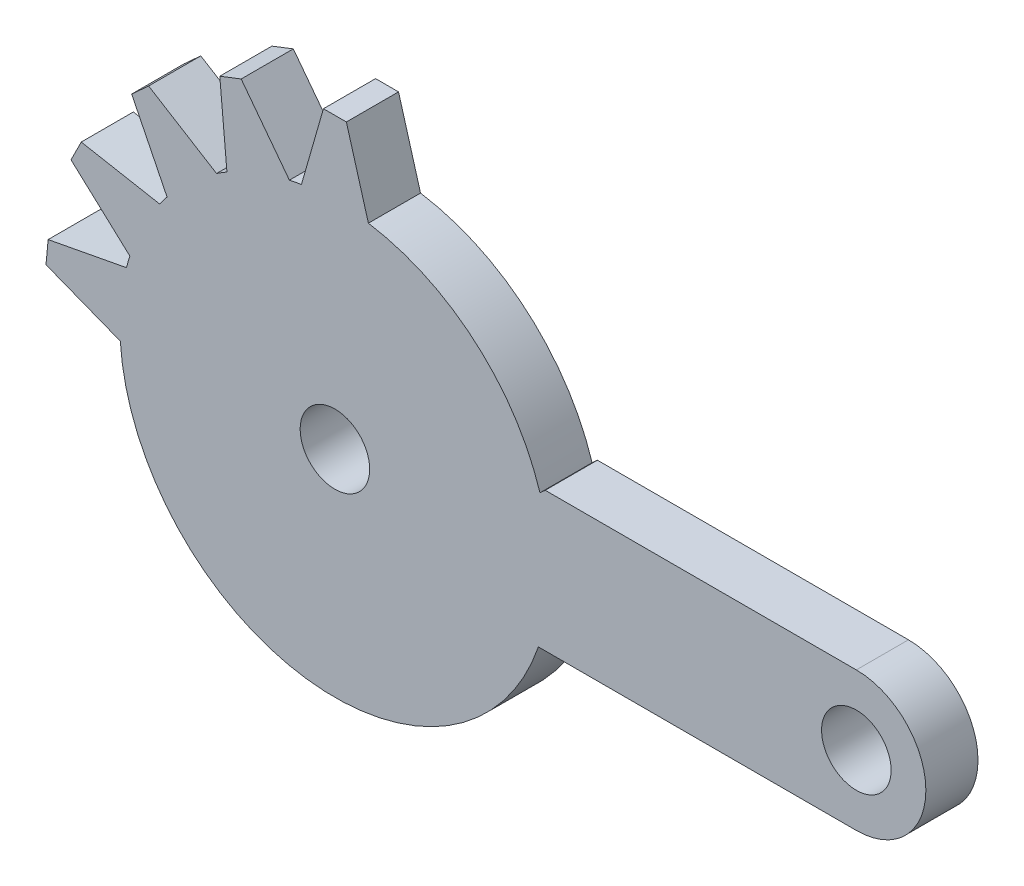
ISO-10303-21;
HEADER;
FILE_DESCRIPTION(('STEP AP214'),'2;1');
FILE_NAME('part.step','',(''),(''),'','','');
FILE_SCHEMA(('AUTOMOTIVE_DESIGN { 1 0 10303 214 1 1 1 1 }'));
ENDSEC;
DATA;
#1=APPLICATION_CONTEXT('core data for automotive mechanical design processes');
#2=APPLICATION_PROTOCOL_DEFINITION('international standard','automotive_design',2000,#1);
#3=PRODUCT_CONTEXT('',#1,'mechanical');
#4=PRODUCT('Part','Part','',(#3));
#5=PRODUCT_RELATED_PRODUCT_CATEGORY('part','',(#4));
#6=PRODUCT_DEFINITION_FORMATION('','',#4);
#7=PRODUCT_DEFINITION_CONTEXT('part definition',#1,'design');
#8=PRODUCT_DEFINITION('design','',#6,#7);
#9=PRODUCT_DEFINITION_SHAPE('','',#8);
#10=(LENGTH_UNIT() NAMED_UNIT(*) SI_UNIT(.MILLI.,.METRE.));
#11=(NAMED_UNIT(*) PLANE_ANGLE_UNIT() SI_UNIT($,.RADIAN.));
#12=(NAMED_UNIT(*) SI_UNIT($,.STERADIAN.) SOLID_ANGLE_UNIT());
#13=UNCERTAINTY_MEASURE_WITH_UNIT(LENGTH_MEASURE(1.E-05),#10,'distance_accuracy_value','');
#14=(GEOMETRIC_REPRESENTATION_CONTEXT(3) GLOBAL_UNCERTAINTY_ASSIGNED_CONTEXT((#13)) GLOBAL_UNIT_ASSIGNED_CONTEXT((#10,
#11,#12)) REPRESENTATION_CONTEXT('',''));
#15=CARTESIAN_POINT('',(0.,0.,0.));
#16=DIRECTION('',(0.,0.,1.));
#17=DIRECTION('',(1.,0.,0.));
#18=AXIS2_PLACEMENT_3D('',#15,#16,#17);
#19=CARTESIAN_POINT('',(0.,0.,0.));
#20=DIRECTION('',(0.,0.,1.));
#21=DIRECTION('',(1.,0.,0.));
#22=AXIS2_PLACEMENT_3D('',#19,#20,#21);
#23=PLANE('',#22);
#24=CARTESIAN_POINT('',(30.,0.,0.));
#25=DIRECTION('',(0.,0.,1.));
#26=DIRECTION('',(1.,0.,0.));
#27=AXIS2_PLACEMENT_3D('',#24,#25,#26);
#28=CIRCLE('',#27,2.);
#29=CARTESIAN_POINT('',(32.,0.,0.));
#30=VERTEX_POINT('',#29);
#31=EDGE_CURVE('E298',#30,#30,#28,.T.);
#32=ORIENTED_EDGE('',*,*,#31,.T.);
#33=EDGE_LOOP('',(#32));
#34=FACE_BOUND('',#33,.T.);
#35=DIRECTION('',(-1.,0.,0.));
#36=VECTOR('',#35,1.);
#37=CARTESIAN_POINT('',(0.,-4.00000000000001,0.));
#38=LINE('',#37,#36);
#39=CARTESIAN_POINT('',(30.,-4.00000000000001,0.));
#40=VERTEX_POINT('',#39);
#41=CARTESIAN_POINT('',(11.7073532313553,-4.00000000000001,0.));
#42=VERTEX_POINT('',#41);
#43=EDGE_CURVE('E241',#40,#42,#38,.T.);
#44=ORIENTED_EDGE('',*,*,#43,.T.);
#45=CARTESIAN_POINT('',(0.,0.,0.));
#46=DIRECTION('',(0.,0.,1.));
#47=DIRECTION('',(1.,0.,0.));
#48=AXIS2_PLACEMENT_3D('',#45,#46,#47);
#49=CIRCLE('',#48,12.3718276614139);
#50=CARTESIAN_POINT('',(-12.346524215559,-0.79085996125604,0.));
#51=VERTEX_POINT('',#50);
#52=EDGE_CURVE('E257',#51,#42,#49,.T.);
#53=ORIENTED_EDGE('',*,*,#52,.F.);
#54=DIRECTION('',(0.931579230851431,-0.363538356499361,0.));
#55=VECTOR('',#54,1.);
#56=CARTESIAN_POINT('',(-1.89955474422704,-4.86767273920467,0.));
#57=LINE('',#56,#55);
#58=CARTESIAN_POINT('',(-16.6216936738179,0.877477016578463,0.));
#59=VERTEX_POINT('',#58);
#60=EDGE_CURVE('E133',#59,#51,#57,.T.);
#61=ORIENTED_EDGE('',*,*,#60,.F.);
#62=DIRECTION('',(0.0922683594632989,0.995734176295035,0.));
#63=VECTOR('',#62,1.);
#64=CARTESIAN_POINT('',(-16.5608037025292,1.53458445577481,0.));
#65=LINE('',#64,#63);
#66=CARTESIAN_POINT('',(-16.499913731241,2.19169189496574,0.));
#67=VERTEX_POINT('',#66);
#68=EDGE_CURVE('E218',#59,#67,#65,.T.);
#69=ORIENTED_EDGE('',*,*,#68,.T.);
#70=DIRECTION('',(0.982517321865762,0.186171190665287,0.));
#71=VECTOR('',#70,1.);
#72=CARTESIAN_POINT('',(-0.972778696233403,5.13383362901551,0.));
#73=LINE('',#72,#71);
#74=CARTESIAN_POINT('',(-11.9909810419501,3.04606193884591,0.));
#75=VERTEX_POINT('',#74);
#76=EDGE_CURVE('E293',#67,#75,#73,.T.);
#77=ORIENTED_EDGE('',*,*,#76,.T.);
#78=CARTESIAN_POINT('',(-11.7984825308017,3.72262402803044,0.));
#79=VERTEX_POINT('',#78);
#80=EDGE_CURVE('E292',#79,#75,#49,.T.);
#81=ORIENTED_EDGE('',*,*,#80,.F.);
#82=DIRECTION('',(0.73734656063406,-0.675514655297073,0.));
#83=VECTOR('',#82,1.);
#84=CARTESIAN_POINT('',(-3.52968825798848,-3.85277133031804,0.));
#85=LINE('',#84,#83);
#86=CARTESIAN_POINT('',(-15.1822864969912,6.82267126748337,0.));
#87=VERTEX_POINT('',#86);
#88=EDGE_CURVE('E290',#87,#79,#85,.T.);
#89=ORIENTED_EDGE('',*,*,#88,.F.);
#90=DIRECTION('',(0.445738355776538,0.895163291355062,0.));
#91=VECTOR('',#90,1.);
#92=CARTESIAN_POINT('',(-14.8881337035164,7.41340971158574,0.));
#93=LINE('',#92,#91);
#94=CARTESIAN_POINT('',(-14.5939809100432,8.00414815568488,0.));
#95=VERTEX_POINT('',#94);
#96=EDGE_CURVE('E287',#87,#95,#93,.T.);
#97=ORIENTED_EDGE('',*,*,#96,.T.);
#98=DIRECTION('',(0.983422908660538,-0.181326729198004,0.));
#99=VECTOR('',#98,1.);
#100=CARTESIAN_POINT('',(0.947465494479553,5.13856548649881,0.));
#101=LINE('',#100,#99);
#102=CARTESIAN_POINT('',(-10.0808923348342,7.17201013783286,0.));
#103=VERTEX_POINT('',#102);
#104=EDGE_CURVE('E284',#95,#103,#101,.T.);
#105=ORIENTED_EDGE('',*,*,#104,.T.);
#106=CARTESIAN_POINT('',(-9.65699040261054,7.7333470145594,0.));
#107=VERTEX_POINT('',#106);
#108=EDGE_CURVE('E283',#107,#103,#49,.T.);
#109=ORIENTED_EDGE('',*,*,#108,.F.);
#110=DIRECTION('',(0.443531151624721,-0.89625895674099,0.));
#111=VECTOR('',#110,1.);
#112=CARTESIAN_POINT('',(-4.68311781383045,-2.31753180432955,0.));
#113=LINE('',#112,#111);
#114=CARTESIAN_POINT('',(-11.6924274007918,11.846425957988,0.));
#115=VERTEX_POINT('',#114);
#116=EDGE_CURVE('E281',#115,#107,#113,.T.);
#117=ORIENTED_EDGE('',*,*,#116,.F.);
#118=DIRECTION('',(0.739008917220658,0.673695643646558,0.));
#119=VECTOR('',#118,1.);
#120=CARTESIAN_POINT('',(-11.2047387498471,12.291012906726,0.));
#121=LINE('',#120,#119);
#122=CARTESIAN_POINT('',(-10.7170500989039,12.7355998554627,0.));
#123=VERTEX_POINT('',#122);
#124=EDGE_CURVE('E278',#115,#123,#121,.T.);
#125=ORIENTED_EDGE('',*,*,#124,.T.);
#126=DIRECTION('',(0.851511782306255,-0.524335469517011,0.));
#127=VECTOR('',#126,1.);
#128=CARTESIAN_POINT('',(2.73974922007617,4.449305601256,0.));
#129=LINE('',#128,#127);
#130=CARTESIAN_POINT('',(-6.80932325774574,10.3293386262251,0.));
#131=VERTEX_POINT('',#130);
#132=EDGE_CURVE('E275',#123,#131,#129,.T.);
#133=ORIENTED_EDGE('',*,*,#132,.T.);
#134=CARTESIAN_POINT('',(-6.21126820931536,10.6996386348167,0.));
#135=VERTEX_POINT('',#134);
#136=EDGE_CURVE('E274',#135,#131,#49,.T.);
#137=ORIENTED_EDGE('',*,*,#136,.F.);
#138=DIRECTION('',(0.08981440289751,-0.995958519734715,0.));
#139=VECTOR('',#138,1.);
#140=CARTESIAN_POINT('',(-5.20406635886307,-0.469296766279788,0.));
#141=LINE('',#140,#139);
#142=CARTESIAN_POINT('',(-6.62344119413828,15.2702551795539,0.));
#143=VERTEX_POINT('',#142);
#144=EDGE_CURVE('E272',#143,#135,#141,.T.);
#145=ORIENTED_EDGE('',*,*,#144,.F.);
#146=DIRECTION('',(0.932472229404356,0.361241666187153,0.));
#147=VECTOR('',#146,1.);
#148=CARTESIAN_POINT('',(-6.0080817404101,15.5086467019597,0.));
#149=LINE('',#148,#147);
#150=CARTESIAN_POINT('',(-5.39272228668254,15.7470382243652,0.));
#151=VERTEX_POINT('',#150);
#152=EDGE_CURVE('E269',#143,#151,#149,.T.);
#153=ORIENTED_EDGE('',*,*,#152,.T.);
#154=DIRECTION('',(0.604599271361842,-0.796529799234611,0.));
#155=VECTOR('',#154,1.);
#156=CARTESIAN_POINT('',(4.16201463202746,3.15914234010969,0.));
#157=LINE('',#156,#155);
#158=CARTESIAN_POINT('',(-2.61811734293581,12.0916326963042,0.));
#159=VERTEX_POINT('',#158);
#160=EDGE_CURVE('E266',#151,#159,#157,.T.);
#161=ORIENTED_EDGE('',*,*,#160,.T.);
#162=CARTESIAN_POINT('',(-1.92667982652666,12.2208847686974,0.));
#163=VERTEX_POINT('',#162);
#164=EDGE_CURVE('E258',#163,#159,#49,.T.);
#165=ORIENTED_EDGE('',*,*,#164,.F.);
#166=DIRECTION('',(-0.276032278619796,-0.961148365841592,0.));
#167=VECTOR('',#166,1.);
#168=CARTESIAN_POINT('',(-5.02217690540434,1.44231940051902,0.));
#169=LINE('',#168,#167);
#170=CARTESIAN_POINT('',(-0.659922552461371,16.6317518237161,0.));
#171=VERTEX_POINT('',#170);
#172=EDGE_CURVE('E264',#171,#163,#169,.T.);
#173=ORIENTED_EDGE('',*,*,#172,.F.);
#174=DIRECTION('',(1.,0.,0.));
#175=VECTOR('',#174,1.);
#176=CARTESIAN_POINT('',(0.,16.6317518237161,0.));
#177=LINE('',#176,#175);
#178=CARTESIAN_POINT('',(0.659922552461371,16.6317518237161,0.));
#179=VERTEX_POINT('',#178);
#180=EDGE_CURVE('E261',#171,#179,#177,.T.);
#181=ORIENTED_EDGE('',*,*,#180,.T.);
#182=DIRECTION('',(0.276032278619796,-0.961148365841592,0.));
#183=VECTOR('',#182,1.);
#184=CARTESIAN_POINT('',(5.02217690540434,1.44231940051902,0.));
#185=LINE('',#184,#183);
#186=CARTESIAN_POINT('',(1.92667982652666,12.2208847686974,0.));
#187=VERTEX_POINT('',#186);
#188=EDGE_CURVE('E256',#179,#187,#185,.T.);
#189=ORIENTED_EDGE('',*,*,#188,.T.);
#190=CARTESIAN_POINT('',(11.7984825308026,3.72262402803444,0.));
#191=VERTEX_POINT('',#190);
#192=EDGE_CURVE('E253',#191,#187,#49,.T.);
#193=ORIENTED_EDGE('',*,*,#192,.F.);
#194=DIRECTION('',(-0.73734656063406,-0.675514655297072,0.));
#195=VECTOR('',#194,1.);
#196=CARTESIAN_POINT('',(3.52968825798749,-3.85277133031695,0.));
#197=LINE('',#196,#195);
#198=CARTESIAN_POINT('',(12.101247566806,4.,0.));
#199=VERTEX_POINT('',#198);
#200=EDGE_CURVE('E251',#199,#191,#197,.T.);
#201=ORIENTED_EDGE('',*,*,#200,.F.);
#202=DIRECTION('',(1.,0.,0.));
#203=VECTOR('',#202,1.);
#204=CARTESIAN_POINT('',(0.,4.,0.));
#205=LINE('',#204,#203);
#206=CARTESIAN_POINT('',(30.,4.00000000000001,0.));
#207=VERTEX_POINT('',#206);
#208=EDGE_CURVE('E248',#199,#207,#205,.T.);
#209=ORIENTED_EDGE('',*,*,#208,.T.);
#210=CARTESIAN_POINT('',(30.,0.,0.));
#211=DIRECTION('',(0.,0.,1.));
#212=DIRECTION('',(1.,0.,0.));
#213=AXIS2_PLACEMENT_3D('',#210,#211,#212);
#214=CIRCLE('',#213,4.00000000000001);
#215=EDGE_CURVE('E244',#40,#207,#214,.T.);
#216=ORIENTED_EDGE('',*,*,#215,.F.);
#217=EDGE_LOOP('',(#44,#53,#61,#69,#77,#81,#89,#97,#105,#109,#117,#125,#133,#137,#145,#153,#161,
#165,#173,#181,#189,#193,#201,#209,#216));
#218=FACE_BOUND('',#217,.T.);
#219=CARTESIAN_POINT('',(0.,0.,0.));
#220=DIRECTION('',(0.,0.,1.));
#221=DIRECTION('',(1.,0.,0.));
#222=AXIS2_PLACEMENT_3D('',#219,#220,#221);
#223=CIRCLE('',#222,3.47214490930269);
#224=CARTESIAN_POINT('',(3.47214490930269,0.,0.));
#225=VERTEX_POINT('',#224);
#226=EDGE_CURVE('E11',#225,#225,#223,.F.);
#227=ORIENTED_EDGE('',*,*,#226,.F.);
#228=EDGE_LOOP('',(#227));
#229=FACE_BOUND('',#228,.T.);
#230=ADVANCED_FACE('F37',(#34,#218,#229),#23,.F.);
#231=CARTESIAN_POINT('',(0.,-4.00000000000001,3.));
#232=DIRECTION('',(0.,-1.,0.));
#233=DIRECTION('',(0.,0.,-1.));
#234=AXIS2_PLACEMENT_3D('',#231,#232,#233);
#235=PLANE('',#234);
#236=ORIENTED_EDGE('',*,*,#43,.F.);
#237=DIRECTION('',(0.,0.,-1.));
#238=VECTOR('',#237,1.);
#239=CARTESIAN_POINT('',(30.,-4.00000000000001,3.));
#240=LINE('',#239,#238);
#241=CARTESIAN_POINT('',(30.,-4.00000000000001,3.));
#242=VERTEX_POINT('',#241);
#243=EDGE_CURVE('E46',#242,#40,#240,.T.);
#244=ORIENTED_EDGE('',*,*,#243,.F.);
#245=DIRECTION('',(-1.,0.,0.));
#246=VECTOR('',#245,1.);
#247=CARTESIAN_POINT('',(0.,-4.00000000000001,3.));
#248=LINE('',#247,#246);
#249=CARTESIAN_POINT('',(11.7073532313553,-4.00000000000001,3.));
#250=VERTEX_POINT('',#249);
#251=EDGE_CURVE('E301',#242,#250,#248,.T.);
#252=ORIENTED_EDGE('',*,*,#251,.T.);
#253=DIRECTION('',(0.,0.,-1.));
#254=VECTOR('',#253,1.);
#255=CARTESIAN_POINT('',(11.7073532313553,-4.00000000000001,3.));
#256=LINE('',#255,#254);
#257=EDGE_CURVE('E140',#250,#42,#256,.T.);
#258=ORIENTED_EDGE('',*,*,#257,.T.);
#259=EDGE_LOOP('',(#236,#244,#252,#258));
#260=FACE_BOUND('',#259,.T.);
#261=ADVANCED_FACE('F39',(#260),#235,.T.);
#262=CARTESIAN_POINT('',(30.,0.,3.));
#263=DIRECTION('',(0.,0.,-1.));
#264=DIRECTION('',(-1.,0.,0.));
#265=AXIS2_PLACEMENT_3D('',#262,#263,#264);
#266=CYLINDRICAL_SURFACE('',#265,4.00000000000001);
#267=ORIENTED_EDGE('',*,*,#215,.T.);
#268=DIRECTION('',(0.,0.,-1.));
#269=VECTOR('',#268,1.);
#270=CARTESIAN_POINT('',(30.,4.00000000000001,3.));
#271=LINE('',#270,#269);
#272=CARTESIAN_POINT('',(30.,4.00000000000001,3.));
#273=VERTEX_POINT('',#272);
#274=EDGE_CURVE('E348',#273,#207,#271,.T.);
#275=ORIENTED_EDGE('',*,*,#274,.F.);
#276=CARTESIAN_POINT('',(30.,0.,3.));
#277=DIRECTION('',(0.,0.,1.));
#278=DIRECTION('',(1.,0.,0.));
#279=AXIS2_PLACEMENT_3D('',#276,#277,#278);
#280=CIRCLE('',#279,4.00000000000001);
#281=EDGE_CURVE('E353',#242,#273,#280,.T.);
#282=ORIENTED_EDGE('',*,*,#281,.F.);
#283=ORIENTED_EDGE('',*,*,#243,.T.);
#284=EDGE_LOOP('',(#267,#275,#282,#283));
#285=FACE_BOUND('',#284,.T.);
#286=ADVANCED_FACE('F351',(#285),#266,.T.);
#287=CARTESIAN_POINT('',(0.,4.,3.));
#288=DIRECTION('',(0.,1.,0.));
#289=DIRECTION('',(-1.,0.,0.));
#290=AXIS2_PLACEMENT_3D('',#287,#288,#289);
#291=PLANE('',#290);
#292=ORIENTED_EDGE('',*,*,#208,.F.);
#293=DIRECTION('',(0.,0.,-1.));
#294=VECTOR('',#293,1.);
#295=CARTESIAN_POINT('',(12.101247566806,4.,3.));
#296=LINE('',#295,#294);
#297=CARTESIAN_POINT('',(12.101247566806,4.,3.));
#298=VERTEX_POINT('',#297);
#299=EDGE_CURVE('E346',#298,#199,#296,.T.);
#300=ORIENTED_EDGE('',*,*,#299,.F.);
#301=DIRECTION('',(1.,0.,0.));
#302=VECTOR('',#301,1.);
#303=CARTESIAN_POINT('',(0.,4.,3.));
#304=LINE('',#303,#302);
#305=EDGE_CURVE('E456',#298,#273,#304,.T.);
#306=ORIENTED_EDGE('',*,*,#305,.T.);
#307=ORIENTED_EDGE('',*,*,#274,.T.);
#308=EDGE_LOOP('',(#292,#300,#306,#307));
#309=FACE_BOUND('',#308,.T.);
#310=ADVANCED_FACE('F364',(#309),#291,.T.);
#311=CARTESIAN_POINT('',(3.52968825798749,-3.85277133031695,3.));
#312=DIRECTION('',(0.675514655297072,-0.73734656063406,0.));
#313=DIRECTION('',(0.73734656063406,0.675514655297072,0.));
#314=AXIS2_PLACEMENT_3D('',#311,#312,#313);
#315=PLANE('',#314);
#316=ORIENTED_EDGE('',*,*,#200,.T.);
#317=DIRECTION('',(0.,0.,-1.));
#318=VECTOR('',#317,1.);
#319=CARTESIAN_POINT('',(11.7984825308026,3.72262402803444,3.));
#320=LINE('',#319,#318);
#321=CARTESIAN_POINT('',(11.7984825308026,3.72262402803444,3.));
#322=VERTEX_POINT('',#321);
#323=EDGE_CURVE('E343',#322,#191,#320,.T.);
#324=ORIENTED_EDGE('',*,*,#323,.F.);
#325=DIRECTION('',(-0.73734656063406,-0.675514655297072,0.));
#326=VECTOR('',#325,1.);
#327=CARTESIAN_POINT('',(3.52968825798749,-3.85277133031695,3.));
#328=LINE('',#327,#326);
#329=EDGE_CURVE('E457',#298,#322,#328,.T.);
#330=ORIENTED_EDGE('',*,*,#329,.F.);
#331=ORIENTED_EDGE('',*,*,#299,.T.);
#332=EDGE_LOOP('',(#316,#324,#330,#331));
#333=FACE_BOUND('',#332,.T.);
#334=ADVANCED_FACE('F445',(#333),#315,.F.);
#335=CARTESIAN_POINT('',(0.,0.,3.));
#336=DIRECTION('',(0.,0.,-1.));
#337=DIRECTION('',(-1.,0.,0.));
#338=AXIS2_PLACEMENT_3D('',#335,#336,#337);
#339=CYLINDRICAL_SURFACE('',#338,12.3718276614139);
#340=ORIENTED_EDGE('',*,*,#192,.T.);
#341=DIRECTION('',(0.,0.,-1.));
#342=VECTOR('',#341,1.);
#343=CARTESIAN_POINT('',(1.92667982652666,12.2208847686974,3.));
#344=LINE('',#343,#342);
#345=CARTESIAN_POINT('',(1.92667982652666,12.2208847686974,3.));
#346=VERTEX_POINT('',#345);
#347=EDGE_CURVE('E341',#346,#187,#344,.T.);
#348=ORIENTED_EDGE('',*,*,#347,.F.);
#349=CARTESIAN_POINT('',(0.,0.,3.));
#350=DIRECTION('',(0.,0.,1.));
#351=DIRECTION('',(1.,0.,0.));
#352=AXIS2_PLACEMENT_3D('',#349,#350,#351);
#353=CIRCLE('',#352,12.3718276614139);
#354=EDGE_CURVE('E459',#322,#346,#353,.T.);
#355=ORIENTED_EDGE('',*,*,#354,.F.);
#356=ORIENTED_EDGE('',*,*,#323,.T.);
#357=EDGE_LOOP('',(#340,#348,#355,#356));
#358=FACE_BOUND('',#357,.T.);
#359=ADVANCED_FACE('F384',(#358),#339,.T.);
#360=CARTESIAN_POINT('',(5.02217690540434,1.44231940051902,3.));
#361=DIRECTION('',(0.961148365841592,0.276032278619796,0.));
#362=DIRECTION('',(-0.276032278619796,0.961148365841592,0.));
#363=AXIS2_PLACEMENT_3D('',#360,#361,#362);
#364=PLANE('',#363);
#365=ORIENTED_EDGE('',*,*,#188,.F.);
#366=DIRECTION('',(0.,0.,-1.));
#367=VECTOR('',#366,1.);
#368=CARTESIAN_POINT('',(0.659922552461371,16.6317518237161,3.));
#369=LINE('',#368,#367);
#370=CARTESIAN_POINT('',(0.659922552461371,16.6317518237161,3.));
#371=VERTEX_POINT('',#370);
#372=EDGE_CURVE('E339',#371,#179,#369,.T.);
#373=ORIENTED_EDGE('',*,*,#372,.F.);
#374=DIRECTION('',(0.276032278619796,-0.961148365841592,0.));
#375=VECTOR('',#374,1.);
#376=CARTESIAN_POINT('',(5.02217690540434,1.44231940051902,3.));
#377=LINE('',#376,#375);
#378=EDGE_CURVE('E465',#371,#346,#377,.T.);
#379=ORIENTED_EDGE('',*,*,#378,.T.);
#380=ORIENTED_EDGE('',*,*,#347,.T.);
#381=EDGE_LOOP('',(#365,#373,#379,#380));
#382=FACE_BOUND('',#381,.T.);
#383=ADVANCED_FACE('F440',(#382),#364,.T.);
#384=CARTESIAN_POINT('',(0.,16.6317518237161,3.));
#385=DIRECTION('',(0.,1.,0.));
#386=DIRECTION('',(0.,0.,1.));
#387=AXIS2_PLACEMENT_3D('',#384,#385,#386);
#388=PLANE('',#387);
#389=ORIENTED_EDGE('',*,*,#180,.F.);
#390=DIRECTION('',(0.,0.,-1.));
#391=VECTOR('',#390,1.);
#392=CARTESIAN_POINT('',(-0.659922552461371,16.6317518237161,3.));
#393=LINE('',#392,#391);
#394=CARTESIAN_POINT('',(-0.659922552461371,16.6317518237161,3.));
#395=VERTEX_POINT('',#394);
#396=EDGE_CURVE('E337',#395,#171,#393,.T.);
#397=ORIENTED_EDGE('',*,*,#396,.F.);
#398=DIRECTION('',(1.,0.,0.));
#399=VECTOR('',#398,1.);
#400=CARTESIAN_POINT('',(0.,16.6317518237161,3.));
#401=LINE('',#400,#399);
#402=EDGE_CURVE('E469',#395,#371,#401,.T.);
#403=ORIENTED_EDGE('',*,*,#402,.T.);
#404=ORIENTED_EDGE('',*,*,#372,.T.);
#405=EDGE_LOOP('',(#389,#397,#403,#404));
#406=FACE_BOUND('',#405,.T.);
#407=ADVANCED_FACE('F436',(#406),#388,.T.);
#408=CARTESIAN_POINT('',(-5.02217690540434,1.44231940051902,3.));
#409=DIRECTION('',(0.961148365841592,-0.276032278619796,0.));
#410=DIRECTION('',(0.276032278619796,0.961148365841592,0.));
#411=AXIS2_PLACEMENT_3D('',#408,#409,#410);
#412=PLANE('',#411);
#413=ORIENTED_EDGE('',*,*,#172,.T.);
#414=DIRECTION('',(0.,0.,-1.));
#415=VECTOR('',#414,1.);
#416=CARTESIAN_POINT('',(-1.92667982652666,12.2208847686974,3.));
#417=LINE('',#416,#415);
#418=CARTESIAN_POINT('',(-1.92667982652666,12.2208847686974,3.));
#419=VERTEX_POINT('',#418);
#420=EDGE_CURVE('E334',#419,#163,#417,.T.);
#421=ORIENTED_EDGE('',*,*,#420,.F.);
#422=DIRECTION('',(-0.276032278619796,-0.961148365841592,0.));
#423=VECTOR('',#422,1.);
#424=CARTESIAN_POINT('',(-5.02217690540434,1.44231940051902,3.));
#425=LINE('',#424,#423);
#426=EDGE_CURVE('E472',#395,#419,#425,.T.);
#427=ORIENTED_EDGE('',*,*,#426,.F.);
#428=ORIENTED_EDGE('',*,*,#396,.T.);
#429=EDGE_LOOP('',(#413,#421,#427,#428));
#430=FACE_BOUND('',#429,.T.);
#431=ADVANCED_FACE('F433',(#430),#412,.F.);
#432=ORIENTED_EDGE('',*,*,#164,.T.);
#433=DIRECTION('',(0.,0.,-1.));
#434=VECTOR('',#433,1.);
#435=CARTESIAN_POINT('',(-2.61811734293581,12.0916326963042,3.));
#436=LINE('',#435,#434);
#437=CARTESIAN_POINT('',(-2.61811734293581,12.0916326963042,3.));
#438=VERTEX_POINT('',#437);
#439=EDGE_CURVE('E332',#438,#159,#436,.T.);
#440=ORIENTED_EDGE('',*,*,#439,.F.);
#441=EDGE_CURVE('E466',#419,#438,#353,.T.);
#442=ORIENTED_EDGE('',*,*,#441,.F.);
#443=ORIENTED_EDGE('',*,*,#420,.T.);
#444=EDGE_LOOP('',(#432,#440,#442,#443));
#445=FACE_BOUND('',#444,.T.);
#446=ADVANCED_FACE('F431',(#445),#339,.T.);
#447=CARTESIAN_POINT('',(4.16201463202746,3.15914234010969,3.));
#448=DIRECTION('',(0.796529799234611,0.604599271361842,0.));
#449=DIRECTION('',(-0.604599271361842,0.796529799234611,0.));
#450=AXIS2_PLACEMENT_3D('',#447,#448,#449);
#451=PLANE('',#450);
#452=ORIENTED_EDGE('',*,*,#160,.F.);
#453=DIRECTION('',(0.,0.,-1.));
#454=VECTOR('',#453,1.);
#455=CARTESIAN_POINT('',(-5.39272228668254,15.7470382243652,3.));
#456=LINE('',#455,#454);
#457=CARTESIAN_POINT('',(-5.39272228668254,15.7470382243652,3.));
#458=VERTEX_POINT('',#457);
#459=EDGE_CURVE('E330',#458,#151,#456,.T.);
#460=ORIENTED_EDGE('',*,*,#459,.F.);
#461=DIRECTION('',(0.604599271361842,-0.796529799234611,0.));
#462=VECTOR('',#461,1.);
#463=CARTESIAN_POINT('',(4.16201463202746,3.15914234010969,3.));
#464=LINE('',#463,#462);
#465=EDGE_CURVE('E474',#458,#438,#464,.T.);
#466=ORIENTED_EDGE('',*,*,#465,.T.);
#467=ORIENTED_EDGE('',*,*,#439,.T.);
#468=EDGE_LOOP('',(#452,#460,#466,#467));
#469=FACE_BOUND('',#468,.T.);
#470=ADVANCED_FACE('F427',(#469),#451,.T.);
#471=CARTESIAN_POINT('',(-6.0080817404101,15.5086467019597,3.));
#472=DIRECTION('',(-0.361241666187153,0.932472229404356,0.));
#473=DIRECTION('',(-0.932472229404356,-0.361241666187153,0.));
#474=AXIS2_PLACEMENT_3D('',#471,#472,#473);
#475=PLANE('',#474);
#476=ORIENTED_EDGE('',*,*,#152,.F.);
#477=DIRECTION('',(0.,0.,-1.));
#478=VECTOR('',#477,1.);
#479=CARTESIAN_POINT('',(-6.62344119413828,15.2702551795539,3.));
#480=LINE('',#479,#478);
#481=CARTESIAN_POINT('',(-6.62344119413828,15.2702551795539,3.));
#482=VERTEX_POINT('',#481);
#483=EDGE_CURVE('E328',#482,#143,#480,.T.);
#484=ORIENTED_EDGE('',*,*,#483,.F.);
#485=DIRECTION('',(0.932472229404356,0.361241666187153,0.));
#486=VECTOR('',#485,1.);
#487=CARTESIAN_POINT('',(-6.0080817404101,15.5086467019597,3.));
#488=LINE('',#487,#486);
#489=EDGE_CURVE('E477',#482,#458,#488,.T.);
#490=ORIENTED_EDGE('',*,*,#489,.T.);
#491=ORIENTED_EDGE('',*,*,#459,.T.);
#492=EDGE_LOOP('',(#476,#484,#490,#491));
#493=FACE_BOUND('',#492,.T.);
#494=ADVANCED_FACE('F423',(#493),#475,.T.);
#495=CARTESIAN_POINT('',(-5.20406635886307,-0.469296766279788,3.));
#496=DIRECTION('',(0.995958519734714,0.08981440289751,0.));
#497=DIRECTION('',(-0.08981440289751,0.995958519734715,0.));
#498=AXIS2_PLACEMENT_3D('',#495,#496,#497);
#499=PLANE('',#498);
#500=ORIENTED_EDGE('',*,*,#144,.T.);
#501=DIRECTION('',(0.,0.,-1.));
#502=VECTOR('',#501,1.);
#503=CARTESIAN_POINT('',(-6.21126820931536,10.6996386348167,3.));
#504=LINE('',#503,#502);
#505=CARTESIAN_POINT('',(-6.21126820931536,10.6996386348167,3.));
#506=VERTEX_POINT('',#505);
#507=EDGE_CURVE('E325',#506,#135,#504,.T.);
#508=ORIENTED_EDGE('',*,*,#507,.F.);
#509=DIRECTION('',(0.08981440289751,-0.995958519734715,0.));
#510=VECTOR('',#509,1.);
#511=CARTESIAN_POINT('',(-5.20406635886307,-0.469296766279788,3.));
#512=LINE('',#511,#510);
#513=EDGE_CURVE('E480',#482,#506,#512,.T.);
#514=ORIENTED_EDGE('',*,*,#513,.F.);
#515=ORIENTED_EDGE('',*,*,#483,.T.);
#516=EDGE_LOOP('',(#500,#508,#514,#515));
#517=FACE_BOUND('',#516,.T.);
#518=ADVANCED_FACE('F420',(#517),#499,.F.);
#519=ORIENTED_EDGE('',*,*,#136,.T.);
#520=DIRECTION('',(0.,0.,-1.));
#521=VECTOR('',#520,1.);
#522=CARTESIAN_POINT('',(-6.80932325774574,10.3293386262251,3.));
#523=LINE('',#522,#521);
#524=CARTESIAN_POINT('',(-6.80932325774574,10.3293386262251,3.));
#525=VERTEX_POINT('',#524);
#526=EDGE_CURVE('E323',#525,#131,#523,.T.);
#527=ORIENTED_EDGE('',*,*,#526,.F.);
#528=EDGE_CURVE('E482',#506,#525,#353,.T.);
#529=ORIENTED_EDGE('',*,*,#528,.F.);
#530=ORIENTED_EDGE('',*,*,#507,.T.);
#531=EDGE_LOOP('',(#519,#527,#529,#530));
#532=FACE_BOUND('',#531,.T.);
#533=ADVANCED_FACE('F418',(#532),#339,.T.);
#534=CARTESIAN_POINT('',(2.73974922007617,4.449305601256,3.));
#535=DIRECTION('',(0.524335469517011,0.851511782306255,0.));
#536=DIRECTION('',(-0.851511782306255,0.524335469517011,0.));
#537=AXIS2_PLACEMENT_3D('',#534,#535,#536);
#538=PLANE('',#537);
#539=ORIENTED_EDGE('',*,*,#132,.F.);
#540=DIRECTION('',(0.,0.,-1.));
#541=VECTOR('',#540,1.);
#542=CARTESIAN_POINT('',(-10.7170500989039,12.7355998554627,3.));
#543=LINE('',#542,#541);
#544=CARTESIAN_POINT('',(-10.7170500989039,12.7355998554627,3.));
#545=VERTEX_POINT('',#544);
#546=EDGE_CURVE('E321',#545,#123,#543,.T.);
#547=ORIENTED_EDGE('',*,*,#546,.F.);
#548=DIRECTION('',(0.851511782306255,-0.524335469517011,0.));
#549=VECTOR('',#548,1.);
#550=CARTESIAN_POINT('',(2.73974922007617,4.449305601256,3.));
#551=LINE('',#550,#549);
#552=EDGE_CURVE('E483',#545,#525,#551,.T.);
#553=ORIENTED_EDGE('',*,*,#552,.T.);
#554=ORIENTED_EDGE('',*,*,#526,.T.);
#555=EDGE_LOOP('',(#539,#547,#553,#554));
#556=FACE_BOUND('',#555,.T.);
#557=ADVANCED_FACE('F414',(#556),#538,.T.);
#558=CARTESIAN_POINT('',(-11.2047387498471,12.291012906726,3.));
#559=DIRECTION('',(-0.673695643646558,0.739008917220658,0.));
#560=DIRECTION('',(-0.739008917220658,-0.673695643646558,0.));
#561=AXIS2_PLACEMENT_3D('',#558,#559,#560);
#562=PLANE('',#561);
#563=ORIENTED_EDGE('',*,*,#124,.F.);
#564=DIRECTION('',(0.,0.,-1.));
#565=VECTOR('',#564,1.);
#566=CARTESIAN_POINT('',(-11.6924274007918,11.846425957988,3.));
#567=LINE('',#566,#565);
#568=CARTESIAN_POINT('',(-11.6924274007918,11.846425957988,3.));
#569=VERTEX_POINT('',#568);
#570=EDGE_CURVE('E319',#569,#115,#567,.T.);
#571=ORIENTED_EDGE('',*,*,#570,.F.);
#572=DIRECTION('',(0.739008917220658,0.673695643646558,0.));
#573=VECTOR('',#572,1.);
#574=CARTESIAN_POINT('',(-11.2047387498471,12.291012906726,3.));
#575=LINE('',#574,#573);
#576=EDGE_CURVE('E486',#569,#545,#575,.T.);
#577=ORIENTED_EDGE('',*,*,#576,.T.);
#578=ORIENTED_EDGE('',*,*,#546,.T.);
#579=EDGE_LOOP('',(#563,#571,#577,#578));
#580=FACE_BOUND('',#579,.T.);
#581=ADVANCED_FACE('F410',(#580),#562,.T.);
#582=CARTESIAN_POINT('',(-4.68311781383045,-2.31753180432955,3.));
#583=DIRECTION('',(0.89625895674099,0.443531151624722,0.));
#584=DIRECTION('',(-0.443531151624722,0.89625895674099,0.));
#585=AXIS2_PLACEMENT_3D('',#582,#583,#584);
#586=PLANE('',#585);
#587=ORIENTED_EDGE('',*,*,#116,.T.);
#588=DIRECTION('',(0.,0.,-1.));
#589=VECTOR('',#588,1.);
#590=CARTESIAN_POINT('',(-9.65699040261054,7.7333470145594,3.));
#591=LINE('',#590,#589);
#592=CARTESIAN_POINT('',(-9.65699040261054,7.7333470145594,3.));
#593=VERTEX_POINT('',#592);
#594=EDGE_CURVE('E316',#593,#107,#591,.T.);
#595=ORIENTED_EDGE('',*,*,#594,.F.);
#596=DIRECTION('',(0.443531151624721,-0.89625895674099,0.));
#597=VECTOR('',#596,1.);
#598=CARTESIAN_POINT('',(-4.68311781383045,-2.31753180432955,3.));
#599=LINE('',#598,#597);
#600=EDGE_CURVE('E489',#569,#593,#599,.T.);
#601=ORIENTED_EDGE('',*,*,#600,.F.);
#602=ORIENTED_EDGE('',*,*,#570,.T.);
#603=EDGE_LOOP('',(#587,#595,#601,#602));
#604=FACE_BOUND('',#603,.T.);
#605=ADVANCED_FACE('F407',(#604),#586,.F.);
#606=ORIENTED_EDGE('',*,*,#108,.T.);
#607=DIRECTION('',(0.,0.,-1.));
#608=VECTOR('',#607,1.);
#609=CARTESIAN_POINT('',(-10.0808923348342,7.17201013783286,3.));
#610=LINE('',#609,#608);
#611=CARTESIAN_POINT('',(-10.0808923348342,7.17201013783286,3.));
#612=VERTEX_POINT('',#611);
#613=EDGE_CURVE('E314',#612,#103,#610,.T.);
#614=ORIENTED_EDGE('',*,*,#613,.F.);
#615=EDGE_CURVE('E491',#593,#612,#353,.T.);
#616=ORIENTED_EDGE('',*,*,#615,.F.);
#617=ORIENTED_EDGE('',*,*,#594,.T.);
#618=EDGE_LOOP('',(#606,#614,#616,#617));
#619=FACE_BOUND('',#618,.T.);
#620=ADVANCED_FACE('F405',(#619),#339,.T.);
#621=CARTESIAN_POINT('',(0.947465494479553,5.13856548649881,3.));
#622=DIRECTION('',(0.181326729198004,0.983422908660539,0.));
#623=DIRECTION('',(-0.983422908660539,0.181326729198004,0.));
#624=AXIS2_PLACEMENT_3D('',#621,#622,#623);
#625=PLANE('',#624);
#626=ORIENTED_EDGE('',*,*,#104,.F.);
#627=DIRECTION('',(0.,0.,-1.));
#628=VECTOR('',#627,1.);
#629=CARTESIAN_POINT('',(-14.5939809100432,8.00414815568488,3.));
#630=LINE('',#629,#628);
#631=CARTESIAN_POINT('',(-14.5939809100432,8.00414815568488,3.));
#632=VERTEX_POINT('',#631);
#633=EDGE_CURVE('E312',#632,#95,#630,.T.);
#634=ORIENTED_EDGE('',*,*,#633,.F.);
#635=DIRECTION('',(0.983422908660538,-0.181326729198004,0.));
#636=VECTOR('',#635,1.);
#637=CARTESIAN_POINT('',(0.947465494479553,5.13856548649881,3.));
#638=LINE('',#637,#636);
#639=EDGE_CURVE('E492',#632,#612,#638,.T.);
#640=ORIENTED_EDGE('',*,*,#639,.T.);
#641=ORIENTED_EDGE('',*,*,#613,.T.);
#642=EDGE_LOOP('',(#626,#634,#640,#641));
#643=FACE_BOUND('',#642,.T.);
#644=ADVANCED_FACE('F401',(#643),#625,.T.);
#645=CARTESIAN_POINT('',(-14.8881337035164,7.41340971158574,3.));
#646=DIRECTION('',(-0.895163291355062,0.445738355776538,0.));
#647=DIRECTION('',(-0.445738355776538,-0.895163291355062,0.));
#648=AXIS2_PLACEMENT_3D('',#645,#646,#647);
#649=PLANE('',#648);
#650=ORIENTED_EDGE('',*,*,#96,.F.);
#651=DIRECTION('',(0.,0.,-1.));
#652=VECTOR('',#651,1.);
#653=CARTESIAN_POINT('',(-15.1822864969912,6.82267126748337,3.));
#654=LINE('',#653,#652);
#655=CARTESIAN_POINT('',(-15.1822864969912,6.82267126748337,3.));
#656=VERTEX_POINT('',#655);
#657=EDGE_CURVE('E310',#656,#87,#654,.T.);
#658=ORIENTED_EDGE('',*,*,#657,.F.);
#659=DIRECTION('',(0.445738355776538,0.895163291355062,0.));
#660=VECTOR('',#659,1.);
#661=CARTESIAN_POINT('',(-14.8881337035164,7.41340971158574,3.));
#662=LINE('',#661,#660);
#663=EDGE_CURVE('E495',#656,#632,#662,.T.);
#664=ORIENTED_EDGE('',*,*,#663,.T.);
#665=ORIENTED_EDGE('',*,*,#633,.T.);
#666=EDGE_LOOP('',(#650,#658,#664,#665));
#667=FACE_BOUND('',#666,.T.);
#668=ADVANCED_FACE('F397',(#667),#649,.T.);
#669=CARTESIAN_POINT('',(-3.52968825798848,-3.85277133031804,3.));
#670=DIRECTION('',(0.675514655297073,0.73734656063406,0.));
#671=DIRECTION('',(-0.73734656063406,0.675514655297073,0.));
#672=AXIS2_PLACEMENT_3D('',#669,#670,#671);
#673=PLANE('',#672);
#674=ORIENTED_EDGE('',*,*,#88,.T.);
#675=DIRECTION('',(0.,0.,-1.));
#676=VECTOR('',#675,1.);
#677=CARTESIAN_POINT('',(-11.7984825308017,3.72262402803044,3.));
#678=LINE('',#677,#676);
#679=CARTESIAN_POINT('',(-11.7984825308017,3.72262402803044,3.));
#680=VERTEX_POINT('',#679);
#681=EDGE_CURVE('E307',#680,#79,#678,.T.);
#682=ORIENTED_EDGE('',*,*,#681,.F.);
#683=DIRECTION('',(0.73734656063406,-0.675514655297073,0.));
#684=VECTOR('',#683,1.);
#685=CARTESIAN_POINT('',(-3.52968825798848,-3.85277133031804,3.));
#686=LINE('',#685,#684);
#687=EDGE_CURVE('E497',#656,#680,#686,.T.);
#688=ORIENTED_EDGE('',*,*,#687,.F.);
#689=ORIENTED_EDGE('',*,*,#657,.T.);
#690=EDGE_LOOP('',(#674,#682,#688,#689));
#691=FACE_BOUND('',#690,.T.);
#692=ADVANCED_FACE('F394',(#691),#673,.F.);
#693=ORIENTED_EDGE('',*,*,#80,.T.);
#694=DIRECTION('',(0.,0.,-1.));
#695=VECTOR('',#694,1.);
#696=CARTESIAN_POINT('',(-11.9909810419501,3.04606193884591,3.));
#697=LINE('',#696,#695);
#698=CARTESIAN_POINT('',(-11.9909810419501,3.04606193884591,3.));
#699=VERTEX_POINT('',#698);
#700=EDGE_CURVE('E305',#699,#75,#697,.T.);
#701=ORIENTED_EDGE('',*,*,#700,.F.);
#702=EDGE_CURVE('E231',#680,#699,#353,.T.);
#703=ORIENTED_EDGE('',*,*,#702,.F.);
#704=ORIENTED_EDGE('',*,*,#681,.T.);
#705=EDGE_LOOP('',(#693,#701,#703,#704));
#706=FACE_BOUND('',#705,.T.);
#707=ADVANCED_FACE('F385',(#706),#339,.T.);
#708=CARTESIAN_POINT('',(-0.972778696233403,5.13383362901551,3.));
#709=DIRECTION('',(-0.186171190665287,0.982517321865762,0.));
#710=DIRECTION('',(-0.982517321865762,-0.186171190665287,0.));
#711=AXIS2_PLACEMENT_3D('',#708,#709,#710);
#712=PLANE('',#711);
#713=ORIENTED_EDGE('',*,*,#76,.F.);
#714=DIRECTION('',(0.,0.,-1.));
#715=VECTOR('',#714,1.);
#716=CARTESIAN_POINT('',(-16.499913731241,2.19169189496574,3.));
#717=LINE('',#716,#715);
#718=CARTESIAN_POINT('',(-16.499913731241,2.19169189496574,3.));
#719=VERTEX_POINT('',#718);
#720=EDGE_CURVE('E219',#719,#67,#717,.T.);
#721=ORIENTED_EDGE('',*,*,#720,.F.);
#722=DIRECTION('',(0.982517321865762,0.186171190665287,0.));
#723=VECTOR('',#722,1.);
#724=CARTESIAN_POINT('',(-0.972778696233403,5.13383362901551,3.));
#725=LINE('',#724,#723);
#726=EDGE_CURVE('E229',#719,#699,#725,.T.);
#727=ORIENTED_EDGE('',*,*,#726,.T.);
#728=ORIENTED_EDGE('',*,*,#700,.T.);
#729=EDGE_LOOP('',(#713,#721,#727,#728));
#730=FACE_BOUND('',#729,.T.);
#731=ADVANCED_FACE('F390',(#730),#712,.T.);
#732=CARTESIAN_POINT('',(-16.5608037025292,1.53458445577481,3.));
#733=DIRECTION('',(-0.995734176295035,0.0922683594632988,0.));
#734=DIRECTION('',(-0.0922683594632988,-0.995734176295035,0.));
#735=AXIS2_PLACEMENT_3D('',#732,#733,#734);
#736=PLANE('',#735);
#737=ORIENTED_EDGE('',*,*,#68,.F.);
#738=DIRECTION('',(0.,0.,-1.));
#739=VECTOR('',#738,1.);
#740=CARTESIAN_POINT('',(-16.6216936738179,0.877477016578463,3.));
#741=LINE('',#740,#739);
#742=CARTESIAN_POINT('',(-16.6216936738179,0.877477016578463,3.));
#743=VERTEX_POINT('',#742);
#744=EDGE_CURVE('E212',#743,#59,#741,.T.);
#745=ORIENTED_EDGE('',*,*,#744,.F.);
#746=DIRECTION('',(0.0922683594632989,0.995734176295035,0.));
#747=VECTOR('',#746,1.);
#748=CARTESIAN_POINT('',(-16.5608037025292,1.53458445577481,3.));
#749=LINE('',#748,#747);
#750=EDGE_CURVE('E216',#743,#719,#749,.T.);
#751=ORIENTED_EDGE('',*,*,#750,.T.);
#752=ORIENTED_EDGE('',*,*,#720,.T.);
#753=EDGE_LOOP('',(#737,#745,#751,#752));
#754=FACE_BOUND('',#753,.T.);
#755=ADVANCED_FACE('F214',(#754),#736,.T.);
#756=CARTESIAN_POINT('',(-1.89955474422704,-4.86767273920467,3.));
#757=DIRECTION('',(0.363538356499361,0.931579230851431,0.));
#758=DIRECTION('',(-0.931579230851431,0.363538356499361,0.));
#759=AXIS2_PLACEMENT_3D('',#756,#757,#758);
#760=PLANE('',#759);
#761=ORIENTED_EDGE('',*,*,#60,.T.);
#762=DIRECTION('',(0.,0.,-1.));
#763=VECTOR('',#762,1.);
#764=CARTESIAN_POINT('',(-12.346524215559,-0.79085996125604,3.));
#765=LINE('',#764,#763);
#766=CARTESIAN_POINT('',(-12.346524215559,-0.79085996125604,3.));
#767=VERTEX_POINT('',#766);
#768=EDGE_CURVE('E220',#767,#51,#765,.T.);
#769=ORIENTED_EDGE('',*,*,#768,.F.);
#770=DIRECTION('',(0.931579230851431,-0.363538356499361,0.));
#771=VECTOR('',#770,1.);
#772=CARTESIAN_POINT('',(-1.89955474422704,-4.86767273920467,3.));
#773=LINE('',#772,#771);
#774=EDGE_CURVE('E222',#743,#767,#773,.T.);
#775=ORIENTED_EDGE('',*,*,#774,.F.);
#776=ORIENTED_EDGE('',*,*,#744,.T.);
#777=EDGE_LOOP('',(#761,#769,#775,#776));
#778=FACE_BOUND('',#777,.T.);
#779=ADVANCED_FACE('F223',(#778),#760,.F.);
#780=CARTESIAN_POINT('',(0.,0.,3.));
#781=DIRECTION('',(0.,0.,-1.));
#782=DIRECTION('',(-1.,0.,0.));
#783=AXIS2_PLACEMENT_3D('',#780,#781,#782);
#784=CYLINDRICAL_SURFACE('',#783,2.);
#785=CARTESIAN_POINT('',(0.,0.,3.));
#786=DIRECTION('',(0.,0.,1.));
#787=DIRECTION('',(1.,0.,0.));
#788=AXIS2_PLACEMENT_3D('',#785,#786,#787);
#789=CIRCLE('',#788,2.);
#790=CARTESIAN_POINT('',(2.,0.,3.));
#791=VERTEX_POINT('',#790);
#792=EDGE_CURVE('E235',#791,#791,#789,.T.);
#793=ORIENTED_EDGE('',*,*,#792,.T.);
#794=EDGE_LOOP('',(#793));
#795=FACE_BOUND('',#794,.T.);
#796=CARTESIAN_POINT('',(0.,0.,-4.5));
#797=DIRECTION('',(0.,0.,-1.));
#798=DIRECTION('',(-1.,0.,0.));
#799=AXIS2_PLACEMENT_3D('',#796,#797,#798);
#800=CIRCLE('',#799,2.);
#801=CARTESIAN_POINT('',(-2.,0.,-4.5));
#802=VERTEX_POINT('',#801);
#803=EDGE_CURVE('E546',#802,#802,#800,.T.);
#804=ORIENTED_EDGE('',*,*,#803,.T.);
#805=EDGE_LOOP('',(#804));
#806=FACE_BOUND('',#805,.T.);
#807=ADVANCED_FACE('F377',(#795,#806),#784,.F.);
#808=ORIENTED_EDGE('',*,*,#52,.T.);
#809=ORIENTED_EDGE('',*,*,#257,.F.);
#810=EDGE_CURVE('E54',#767,#250,#353,.T.);
#811=ORIENTED_EDGE('',*,*,#810,.F.);
#812=ORIENTED_EDGE('',*,*,#768,.T.);
#813=EDGE_LOOP('',(#808,#809,#811,#812));
#814=FACE_BOUND('',#813,.T.);
#815=ADVANCED_FACE('F375',(#814),#339,.T.);
#816=CARTESIAN_POINT('',(30.,0.,3.));
#817=DIRECTION('',(0.,0.,-1.));
#818=DIRECTION('',(-1.,0.,0.));
#819=AXIS2_PLACEMENT_3D('',#816,#817,#818);
#820=CYLINDRICAL_SURFACE('',#819,2.);
#821=CARTESIAN_POINT('',(30.,0.,3.));
#822=DIRECTION('',(0.,0.,1.));
#823=DIRECTION('',(1.,0.,0.));
#824=AXIS2_PLACEMENT_3D('',#821,#822,#823);
#825=CIRCLE('',#824,2.);
#826=CARTESIAN_POINT('',(32.,0.,3.));
#827=VERTEX_POINT('',#826);
#828=EDGE_CURVE('E238',#827,#827,#825,.T.);
#829=ORIENTED_EDGE('',*,*,#828,.T.);
#830=EDGE_LOOP('',(#829));
#831=FACE_BOUND('',#830,.T.);
#832=ORIENTED_EDGE('',*,*,#31,.F.);
#833=EDGE_LOOP('',(#832));
#834=FACE_BOUND('',#833,.T.);
#835=ADVANCED_FACE('F372',(#831,#834),#820,.F.);
#836=CARTESIAN_POINT('',(0.,0.,3.));
#837=DIRECTION('',(0.,0.,1.));
#838=DIRECTION('',(1.,0.,0.));
#839=AXIS2_PLACEMENT_3D('',#836,#837,#838);
#840=PLANE('',#839);
#841=ORIENTED_EDGE('',*,*,#251,.F.);
#842=ORIENTED_EDGE('',*,*,#281,.T.);
#843=ORIENTED_EDGE('',*,*,#305,.F.);
#844=ORIENTED_EDGE('',*,*,#329,.T.);
#845=ORIENTED_EDGE('',*,*,#354,.T.);
#846=ORIENTED_EDGE('',*,*,#378,.F.);
#847=ORIENTED_EDGE('',*,*,#402,.F.);
#848=ORIENTED_EDGE('',*,*,#426,.T.);
#849=ORIENTED_EDGE('',*,*,#441,.T.);
#850=ORIENTED_EDGE('',*,*,#465,.F.);
#851=ORIENTED_EDGE('',*,*,#489,.F.);
#852=ORIENTED_EDGE('',*,*,#513,.T.);
#853=ORIENTED_EDGE('',*,*,#528,.T.);
#854=ORIENTED_EDGE('',*,*,#552,.F.);
#855=ORIENTED_EDGE('',*,*,#576,.F.);
#856=ORIENTED_EDGE('',*,*,#600,.T.);
#857=ORIENTED_EDGE('',*,*,#615,.T.);
#858=ORIENTED_EDGE('',*,*,#639,.F.);
#859=ORIENTED_EDGE('',*,*,#663,.F.);
#860=ORIENTED_EDGE('',*,*,#687,.T.);
#861=ORIENTED_EDGE('',*,*,#702,.T.);
#862=ORIENTED_EDGE('',*,*,#726,.F.);
#863=ORIENTED_EDGE('',*,*,#750,.F.);
#864=ORIENTED_EDGE('',*,*,#774,.T.);
#865=ORIENTED_EDGE('',*,*,#810,.T.);
#866=EDGE_LOOP('',(#841,#842,#843,#844,#845,#846,#847,#848,#849,#850,#851,#852,#853,#854,#855,
#856,#857,#858,#859,#860,#861,#862,#863,#864,#865));
#867=FACE_BOUND('',#866,.T.);
#868=ORIENTED_EDGE('',*,*,#792,.F.);
#869=EDGE_LOOP('',(#868));
#870=FACE_BOUND('',#869,.T.);
#871=ORIENTED_EDGE('',*,*,#828,.F.);
#872=EDGE_LOOP('',(#871));
#873=FACE_BOUND('',#872,.T.);
#874=ADVANCED_FACE('F226',(#867,#870,#873),#840,.T.);
#875=CARTESIAN_POINT('',(0.,0.,-4.5));
#876=DIRECTION('',(0.,0.,-1.));
#877=DIRECTION('',(-1.,0.,0.));
#878=AXIS2_PLACEMENT_3D('',#875,#876,#877);
#879=PLANE('',#878);
#880=CARTESIAN_POINT('',(0.,0.,-4.5));
#881=DIRECTION('',(0.,0.,-1.));
#882=DIRECTION('',(-1.,0.,0.));
#883=AXIS2_PLACEMENT_3D('',#880,#881,#882);
#884=CIRCLE('',#883,3.47214490930269);
#885=CARTESIAN_POINT('',(-3.47214490930269,0.,-4.5));
#886=VERTEX_POINT('',#885);
#887=EDGE_CURVE('E245',#886,#886,#884,.T.);
#888=ORIENTED_EDGE('',*,*,#887,.T.);
#889=EDGE_LOOP('',(#888));
#890=FACE_BOUND('',#889,.T.);
#891=ORIENTED_EDGE('',*,*,#803,.F.);
#892=EDGE_LOOP('',(#891));
#893=FACE_BOUND('',#892,.T.);
#894=ADVANCED_FACE('F551',(#890,#893),#879,.T.);
#895=CARTESIAN_POINT('',(0.,0.,-4.5));
#896=DIRECTION('',(0.,0.,1.));
#897=DIRECTION('',(1.,0.,0.));
#898=AXIS2_PLACEMENT_3D('',#895,#896,#897);
#899=CYLINDRICAL_SURFACE('',#898,3.47214490930269);
#900=ORIENTED_EDGE('',*,*,#887,.F.);
#901=EDGE_LOOP('',(#900));
#902=FACE_BOUND('',#901,.T.);
#903=ORIENTED_EDGE('',*,*,#226,.T.);
#904=EDGE_LOOP('',(#903));
#905=FACE_BOUND('',#904,.T.);
#906=ADVANCED_FACE('F553',(#902,#905),#899,.T.);
#907=CLOSED_SHELL('',(#230,#261,#286,#310,#334,#359,#383,#407,#431,#446,#470,#494,#518,#533,
#557,#581,#605,#620,#644,#668,#692,#707,#731,#755,#779,#807,#815,#835,#874,#894,#906));
#908=MANIFOLD_SOLID_BREP('B2',#907);
#909=ADVANCED_BREP_SHAPE_REPRESENTATION('',(#18,#908),#14);
#910=SHAPE_DEFINITION_REPRESENTATION(#9,#909);
ENDSEC;
END-ISO-10303-21;
